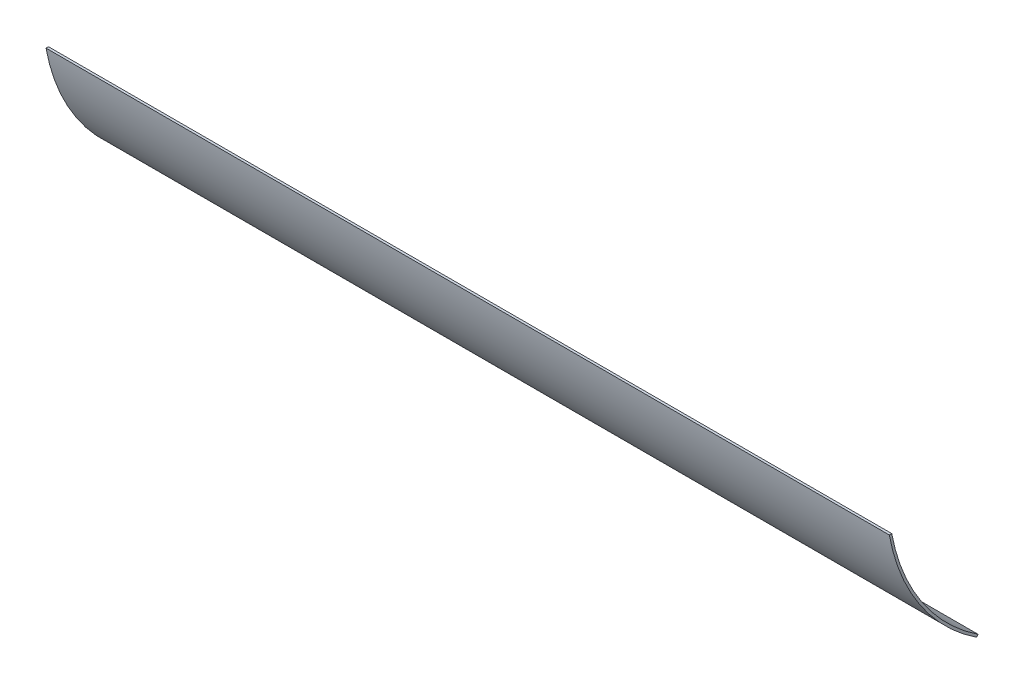
ISO-10303-21;
HEADER;
FILE_DESCRIPTION(('STEP AP214'),'2;1');
FILE_NAME('part.step','',(''),(''),'','','');
FILE_SCHEMA(('AUTOMOTIVE_DESIGN { 1 0 10303 214 1 1 1 1 }'));
ENDSEC;
DATA;
#1=APPLICATION_CONTEXT('core data for automotive mechanical design processes');
#2=APPLICATION_PROTOCOL_DEFINITION('international standard','automotive_design',2000,#1);
#3=PRODUCT_CONTEXT('',#1,'mechanical');
#4=PRODUCT('Part','Part','',(#3));
#5=PRODUCT_RELATED_PRODUCT_CATEGORY('part','',(#4));
#6=PRODUCT_DEFINITION_FORMATION('','',#4);
#7=PRODUCT_DEFINITION_CONTEXT('part definition',#1,'design');
#8=PRODUCT_DEFINITION('design','',#6,#7);
#9=PRODUCT_DEFINITION_SHAPE('','',#8);
#10=(LENGTH_UNIT() NAMED_UNIT(*) SI_UNIT(.MILLI.,.METRE.));
#11=(NAMED_UNIT(*) PLANE_ANGLE_UNIT() SI_UNIT($,.RADIAN.));
#12=(NAMED_UNIT(*) SI_UNIT($,.STERADIAN.) SOLID_ANGLE_UNIT());
#13=UNCERTAINTY_MEASURE_WITH_UNIT(LENGTH_MEASURE(1.E-05),#10,'distance_accuracy_value','');
#14=(GEOMETRIC_REPRESENTATION_CONTEXT(3) GLOBAL_UNCERTAINTY_ASSIGNED_CONTEXT((#13)) GLOBAL_UNIT_ASSIGNED_CONTEXT((#10,
#11,#12)) REPRESENTATION_CONTEXT('',''));
#15=CARTESIAN_POINT('',(0.,0.,0.));
#16=DIRECTION('',(0.,0.,1.));
#17=DIRECTION('',(1.,0.,0.));
#18=AXIS2_PLACEMENT_3D('',#15,#16,#17);
#19=CARTESIAN_POINT('',(558.8,0.,0.));
#20=DIRECTION('',(-1.,0.,0.));
#21=DIRECTION('',(0.,0.,1.));
#22=AXIS2_PLACEMENT_3D('',#19,#20,#21);
#23=CYLINDRICAL_SURFACE('',#22,132.08);
#24=CARTESIAN_POINT('',(0.,0.,0.));
#25=DIRECTION('',(-1.,0.,0.));
#26=DIRECTION('',(0.,0.,-1.));
#27=AXIS2_PLACEMENT_3D('',#24,#25,#26);
#28=CIRCLE('',#27,132.08);
#29=CARTESIAN_POINT('',(0.,-110.235992990919,72.7540531469284));
#30=VERTEX_POINT('',#29);
#31=CARTESIAN_POINT('',(0.,-23.876,129.904053146928));
#32=VERTEX_POINT('',#31);
#33=EDGE_CURVE('E95',#30,#32,#28,.T.);
#34=ORIENTED_EDGE('',*,*,#33,.T.);
#35=DIRECTION('',(-1.,0.,0.));
#36=VECTOR('',#35,1.);
#37=CARTESIAN_POINT('',(558.8,-23.876,129.904053146928));
#38=LINE('',#37,#36);
#39=CARTESIAN_POINT('',(558.8,-23.876,129.904053146928));
#40=VERTEX_POINT('',#39);
#41=EDGE_CURVE('E11',#40,#32,#38,.T.);
#42=ORIENTED_EDGE('',*,*,#41,.F.);
#43=CARTESIAN_POINT('',(558.8,0.,0.));
#44=DIRECTION('',(-1.,0.,0.));
#45=DIRECTION('',(0.,0.,-1.));
#46=AXIS2_PLACEMENT_3D('',#43,#44,#45);
#47=CIRCLE('',#46,132.08);
#48=CARTESIAN_POINT('',(558.8,-110.235992990919,72.7540531469284));
#49=VERTEX_POINT('',#48);
#50=EDGE_CURVE('E83',#49,#40,#47,.T.);
#51=ORIENTED_EDGE('',*,*,#50,.F.);
#52=DIRECTION('',(-1.,0.,0.));
#53=VECTOR('',#52,1.);
#54=CARTESIAN_POINT('',(558.8,-110.235992990919,72.7540531469284));
#55=LINE('',#54,#53);
#56=EDGE_CURVE('E91',#49,#30,#55,.T.);
#57=ORIENTED_EDGE('',*,*,#56,.T.);
#58=EDGE_LOOP('',(#34,#42,#51,#57));
#59=FACE_BOUND('',#58,.T.);
#60=ADVANCED_FACE('F32',(#59),#23,.F.);
#61=CARTESIAN_POINT('',(558.8,-23.876,129.904053146928));
#62=DIRECTION('',(0.,-1.,0.));
#63=DIRECTION('',(0.,0.,-1.));
#64=AXIS2_PLACEMENT_3D('',#61,#62,#63);
#65=PLANE('',#64);
#66=DIRECTION('',(0.,0.,1.));
#67=VECTOR('',#66,1.);
#68=CARTESIAN_POINT('',(0.,-23.876,129.904053146928));
#69=LINE('',#68,#67);
#70=CARTESIAN_POINT('',(0.,-23.876,131.517820770609));
#71=VERTEX_POINT('',#70);
#72=EDGE_CURVE('E87',#32,#71,#69,.T.);
#73=ORIENTED_EDGE('',*,*,#72,.T.);
#74=DIRECTION('',(-1.,0.,0.));
#75=VECTOR('',#74,1.);
#76=CARTESIAN_POINT('',(558.8,-23.876,131.517820770609));
#77=LINE('',#76,#75);
#78=CARTESIAN_POINT('',(558.8,-23.876,131.517820770609));
#79=VERTEX_POINT('',#78);
#80=EDGE_CURVE('E40',#79,#71,#77,.T.);
#81=ORIENTED_EDGE('',*,*,#80,.F.);
#82=DIRECTION('',(0.,0.,1.));
#83=VECTOR('',#82,1.);
#84=CARTESIAN_POINT('',(558.8,-23.876,129.904053146928));
#85=LINE('',#84,#83);
#86=EDGE_CURVE('E78',#40,#79,#85,.T.);
#87=ORIENTED_EDGE('',*,*,#86,.F.);
#88=ORIENTED_EDGE('',*,*,#41,.T.);
#89=EDGE_LOOP('',(#73,#81,#87,#88));
#90=FACE_BOUND('',#89,.T.);
#91=ADVANCED_FACE('F86',(#90),#65,.F.);
#92=CARTESIAN_POINT('',(558.8,0.,0.));
#93=DIRECTION('',(-1.,0.,0.));
#94=DIRECTION('',(0.,0.,1.));
#95=AXIS2_PLACEMENT_3D('',#92,#93,#94);
#96=CYLINDRICAL_SURFACE('',#95,133.6675);
#97=CARTESIAN_POINT('',(0.,0.,0.));
#98=DIRECTION('',(1.,0.,0.));
#99=DIRECTION('',(0.,0.,-1.));
#100=AXIS2_PLACEMENT_3D('',#97,#98,#99);
#101=CIRCLE('',#100,133.6675);
#102=CARTESIAN_POINT('',(0.,-111.560944829752,73.6285009010982));
#103=VERTEX_POINT('',#102);
#104=EDGE_CURVE('E65',#71,#103,#101,.T.);
#105=ORIENTED_EDGE('',*,*,#104,.T.);
#106=DIRECTION('',(-1.,0.,0.));
#107=VECTOR('',#106,1.);
#108=CARTESIAN_POINT('',(558.8,-111.560944829752,73.6285009010982));
#109=LINE('',#108,#107);
#110=CARTESIAN_POINT('',(558.8,-111.560944829752,73.6285009010982));
#111=VERTEX_POINT('',#110);
#112=EDGE_CURVE('E88',#111,#103,#109,.T.);
#113=ORIENTED_EDGE('',*,*,#112,.F.);
#114=CARTESIAN_POINT('',(558.8,0.,0.));
#115=DIRECTION('',(1.,0.,0.));
#116=DIRECTION('',(0.,0.,-1.));
#117=AXIS2_PLACEMENT_3D('',#114,#115,#116);
#118=CIRCLE('',#117,133.6675);
#119=EDGE_CURVE('E81',#79,#111,#118,.T.);
#120=ORIENTED_EDGE('',*,*,#119,.F.);
#121=ORIENTED_EDGE('',*,*,#80,.T.);
#122=EDGE_LOOP('',(#105,#113,#120,#121));
#123=FACE_BOUND('',#122,.T.);
#124=ADVANCED_FACE('F89',(#123),#96,.T.);
#125=CARTESIAN_POINT('',(558.8,-110.235992990919,72.7540531469284));
#126=DIRECTION('',(0.,0.550833230973109,0.834615331548448));
#127=DIRECTION('',(0.,-0.834615331548448,0.550833230973109));
#128=AXIS2_PLACEMENT_3D('',#125,#126,#127);
#129=PLANE('',#128);
#130=DIRECTION('',(0.,0.834615331548448,-0.550833230973109));
#131=VECTOR('',#130,1.);
#132=CARTESIAN_POINT('',(0.,-110.235992990919,72.7540531469284));
#133=LINE('',#132,#131);
#134=EDGE_CURVE('E71',#103,#30,#133,.T.);
#135=ORIENTED_EDGE('',*,*,#134,.T.);
#136=ORIENTED_EDGE('',*,*,#56,.F.);
#137=DIRECTION('',(0.,0.834615331548448,-0.550833230973109));
#138=VECTOR('',#137,1.);
#139=CARTESIAN_POINT('',(558.8,-110.235992990919,72.7540531469284));
#140=LINE('',#139,#138);
#141=EDGE_CURVE('E48',#111,#49,#140,.T.);
#142=ORIENTED_EDGE('',*,*,#141,.F.);
#143=ORIENTED_EDGE('',*,*,#112,.T.);
#144=EDGE_LOOP('',(#135,#136,#142,#143));
#145=FACE_BOUND('',#144,.T.);
#146=ADVANCED_FACE('F102',(#145),#129,.F.);
#147=CARTESIAN_POINT('',(558.8,0.,0.));
#148=DIRECTION('',(1.,0.,0.));
#149=DIRECTION('',(0.,0.,-1.));
#150=AXIS2_PLACEMENT_3D('',#147,#148,#149);
#151=PLANE('',#150);
#152=ORIENTED_EDGE('',*,*,#50,.T.);
#153=ORIENTED_EDGE('',*,*,#86,.T.);
#154=ORIENTED_EDGE('',*,*,#119,.T.);
#155=ORIENTED_EDGE('',*,*,#141,.T.);
#156=EDGE_LOOP('',(#152,#153,#154,#155));
#157=FACE_BOUND('',#156,.T.);
#158=ADVANCED_FACE('F79',(#157),#151,.T.);
#159=CARTESIAN_POINT('',(0.,0.,0.));
#160=DIRECTION('',(1.,0.,0.));
#161=DIRECTION('',(0.,0.,-1.));
#162=AXIS2_PLACEMENT_3D('',#159,#160,#161);
#163=PLANE('',#162);
#164=ORIENTED_EDGE('',*,*,#33,.F.);
#165=ORIENTED_EDGE('',*,*,#134,.F.);
#166=ORIENTED_EDGE('',*,*,#104,.F.);
#167=ORIENTED_EDGE('',*,*,#72,.F.);
#168=EDGE_LOOP('',(#164,#165,#166,#167));
#169=FACE_BOUND('',#168,.T.);
#170=ADVANCED_FACE('F105',(#169),#163,.F.);
#171=CLOSED_SHELL('',(#60,#91,#124,#146,#158,#170));
#172=MANIFOLD_SOLID_BREP('B2',#171);
#173=ADVANCED_BREP_SHAPE_REPRESENTATION('',(#18,#172),#14);
#174=SHAPE_DEFINITION_REPRESENTATION(#9,#173);
ENDSEC;
END-ISO-10303-21;
